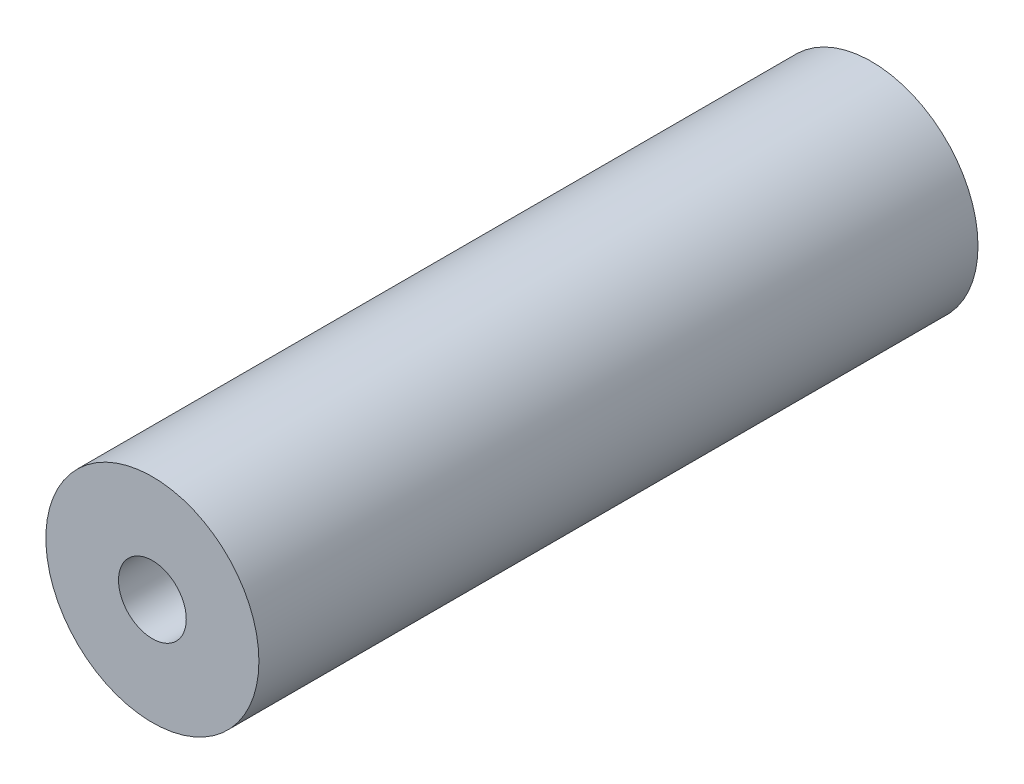
ISO-10303-21;
HEADER;
FILE_DESCRIPTION(('STEP AP214'),'2;1');
FILE_NAME('part.step','',(''),(''),'','','');
FILE_SCHEMA(('AUTOMOTIVE_DESIGN { 1 0 10303 214 1 1 1 1 }'));
ENDSEC;
DATA;
#1=APPLICATION_CONTEXT('core data for automotive mechanical design processes');
#2=APPLICATION_PROTOCOL_DEFINITION('international standard','automotive_design',2000,#1);
#3=PRODUCT_CONTEXT('',#1,'mechanical');
#4=PRODUCT('Part','Part','',(#3));
#5=PRODUCT_RELATED_PRODUCT_CATEGORY('part','',(#4));
#6=PRODUCT_DEFINITION_FORMATION('','',#4);
#7=PRODUCT_DEFINITION_CONTEXT('part definition',#1,'design');
#8=PRODUCT_DEFINITION('design','',#6,#7);
#9=PRODUCT_DEFINITION_SHAPE('','',#8);
#10=(LENGTH_UNIT() NAMED_UNIT(*) SI_UNIT(.MILLI.,.METRE.));
#11=(NAMED_UNIT(*) PLANE_ANGLE_UNIT() SI_UNIT($,.RADIAN.));
#12=(NAMED_UNIT(*) SI_UNIT($,.STERADIAN.) SOLID_ANGLE_UNIT());
#13=UNCERTAINTY_MEASURE_WITH_UNIT(LENGTH_MEASURE(1.E-05),#10,'distance_accuracy_value','');
#14=(GEOMETRIC_REPRESENTATION_CONTEXT(3) GLOBAL_UNCERTAINTY_ASSIGNED_CONTEXT((#13)) GLOBAL_UNIT_ASSIGNED_CONTEXT((#10,
#11,#12)) REPRESENTATION_CONTEXT('',''));
#15=CARTESIAN_POINT('',(0.,0.,0.));
#16=DIRECTION('',(0.,0.,1.));
#17=DIRECTION('',(1.,0.,0.));
#18=AXIS2_PLACEMENT_3D('',#15,#16,#17);
#19=CARTESIAN_POINT('',(0.,0.,21.43125));
#20=DIRECTION('',(0.,0.,-1.));
#21=DIRECTION('',(-1.,0.,0.));
#22=AXIS2_PLACEMENT_3D('',#19,#20,#21);
#23=CYLINDRICAL_SURFACE('',#22,6.35);
#24=CARTESIAN_POINT('',(0.,0.,21.43125));
#25=DIRECTION('',(0.,0.,1.));
#26=DIRECTION('',(1.,0.,0.));
#27=AXIS2_PLACEMENT_3D('',#24,#25,#26);
#28=CIRCLE('',#27,6.35);
#29=CARTESIAN_POINT('',(6.35,0.,21.43125));
#30=VERTEX_POINT('',#29);
#31=EDGE_CURVE('E11',#30,#30,#28,.T.);
#32=ORIENTED_EDGE('',*,*,#31,.F.);
#33=EDGE_LOOP('',(#32));
#34=FACE_BOUND('',#33,.T.);
#35=CARTESIAN_POINT('',(0.,0.,-21.43125));
#36=DIRECTION('',(0.,0.,1.));
#37=DIRECTION('',(1.,0.,0.));
#38=AXIS2_PLACEMENT_3D('',#35,#36,#37);
#39=CIRCLE('',#38,6.35);
#40=CARTESIAN_POINT('',(6.35,0.,-21.43125));
#41=VERTEX_POINT('',#40);
#42=EDGE_CURVE('E56',#41,#41,#39,.T.);
#43=ORIENTED_EDGE('',*,*,#42,.T.);
#44=EDGE_LOOP('',(#43));
#45=FACE_BOUND('',#44,.T.);
#46=ADVANCED_FACE('F53',(#34,#45),#23,.T.);
#47=CARTESIAN_POINT('',(0.,0.,21.43125));
#48=DIRECTION('',(0.,0.,1.));
#49=DIRECTION('',(1.,0.,0.));
#50=AXIS2_PLACEMENT_3D('',#47,#48,#49);
#51=PLANE('',#50);
#52=CARTESIAN_POINT('',(0.,0.,21.43125));
#53=DIRECTION('',(0.,0.,1.));
#54=DIRECTION('',(1.,0.,0.));
#55=AXIS2_PLACEMENT_3D('',#52,#53,#54);
#56=CIRCLE('',#55,2.01929999999999);
#57=CARTESIAN_POINT('',(2.01929999999999,0.,21.43125));
#58=VERTEX_POINT('',#57);
#59=EDGE_CURVE('E77',#58,#58,#56,.T.);
#60=ORIENTED_EDGE('',*,*,#59,.F.);
#61=EDGE_LOOP('',(#60));
#62=FACE_BOUND('',#61,.T.);
#63=ORIENTED_EDGE('',*,*,#31,.T.);
#64=EDGE_LOOP('',(#63));
#65=FACE_BOUND('',#64,.T.);
#66=ADVANCED_FACE('F95',(#62,#65),#51,.T.);
#67=CARTESIAN_POINT('',(0.,0.,-21.43125));
#68=DIRECTION('',(0.,0.,1.));
#69=DIRECTION('',(1.,0.,0.));
#70=AXIS2_PLACEMENT_3D('',#67,#68,#69);
#71=PLANE('',#70);
#72=CARTESIAN_POINT('',(0.,0.,-21.43125));
#73=DIRECTION('',(0.,0.,-1.));
#74=DIRECTION('',(-1.,0.,0.));
#75=AXIS2_PLACEMENT_3D('',#72,#73,#74);
#76=CIRCLE('',#75,2.01929999999999);
#77=CARTESIAN_POINT('',(-2.01929999999999,0.,-21.43125));
#78=VERTEX_POINT('',#77);
#79=EDGE_CURVE('E76',#78,#78,#76,.T.);
#80=ORIENTED_EDGE('',*,*,#79,.F.);
#81=EDGE_LOOP('',(#80));
#82=FACE_BOUND('',#81,.T.);
#83=ORIENTED_EDGE('',*,*,#42,.F.);
#84=EDGE_LOOP('',(#83));
#85=FACE_BOUND('',#84,.T.);
#86=ADVANCED_FACE('F92',(#82,#85),#71,.F.);
#87=CARTESIAN_POINT('',(0.,0.,-9.40181));
#88=DIRECTION('',(0.,0.,-1.));
#89=DIRECTION('',(-1.,0.,0.));
#90=AXIS2_PLACEMENT_3D('',#87,#88,#89);
#91=CONICAL_SURFACE('',#90,2.01929999999999,1.02974425867665);
#92=CARTESIAN_POINT('',(0.,0.,-8.18849215199765));
#93=VERTEX_POINT('',#92);
#94=VERTEX_LOOP('',#93);
#95=FACE_BOUND('',#94,.T.);
#96=CARTESIAN_POINT('',(0.,0.,-9.40181));
#97=DIRECTION('',(0.,0.,-1.));
#98=DIRECTION('',(-1.,0.,0.));
#99=AXIS2_PLACEMENT_3D('',#96,#97,#98);
#100=CIRCLE('',#99,2.01929999999999);
#101=CARTESIAN_POINT('',(-2.01929999999999,0.,-9.40181));
#102=VERTEX_POINT('',#101);
#103=EDGE_CURVE('E80',#102,#102,#100,.T.);
#104=ORIENTED_EDGE('',*,*,#103,.T.);
#105=EDGE_LOOP('',(#104));
#106=FACE_BOUND('',#105,.T.);
#107=ADVANCED_FACE('F94',(#95,#106),#91,.F.);
#108=CARTESIAN_POINT('',(0.,0.,-21.43125));
#109=DIRECTION('',(0.,0.,-1.));
#110=DIRECTION('',(-1.,0.,0.));
#111=AXIS2_PLACEMENT_3D('',#108,#109,#110);
#112=CYLINDRICAL_SURFACE('',#111,2.01929999999999);
#113=ORIENTED_EDGE('',*,*,#103,.F.);
#114=EDGE_LOOP('',(#113));
#115=FACE_BOUND('',#114,.T.);
#116=ORIENTED_EDGE('',*,*,#79,.T.);
#117=EDGE_LOOP('',(#116));
#118=FACE_BOUND('',#117,.T.);
#119=ADVANCED_FACE('F70',(#115,#118),#112,.F.);
#120=CARTESIAN_POINT('',(0.,0.,9.40181));
#121=DIRECTION('',(0.,0.,1.));
#122=DIRECTION('',(1.,0.,0.));
#123=AXIS2_PLACEMENT_3D('',#120,#121,#122);
#124=CONICAL_SURFACE('',#123,2.01929999999999,1.02974425867665);
#125=CARTESIAN_POINT('',(0.,0.,8.18849215199765));
#126=VERTEX_POINT('',#125);
#127=VERTEX_LOOP('',#126);
#128=FACE_BOUND('',#127,.T.);
#129=CARTESIAN_POINT('',(0.,0.,9.40181));
#130=DIRECTION('',(0.,0.,1.));
#131=DIRECTION('',(1.,0.,0.));
#132=AXIS2_PLACEMENT_3D('',#129,#130,#131);
#133=CIRCLE('',#132,2.01929999999999);
#134=CARTESIAN_POINT('',(2.01929999999999,0.,9.40181));
#135=VERTEX_POINT('',#134);
#136=EDGE_CURVE('E74',#135,#135,#133,.T.);
#137=ORIENTED_EDGE('',*,*,#136,.T.);
#138=EDGE_LOOP('',(#137));
#139=FACE_BOUND('',#138,.T.);
#140=ADVANCED_FACE('F66',(#128,#139),#124,.F.);
#141=CARTESIAN_POINT('',(0.,0.,21.43125));
#142=DIRECTION('',(0.,0.,1.));
#143=DIRECTION('',(1.,0.,0.));
#144=AXIS2_PLACEMENT_3D('',#141,#142,#143);
#145=CYLINDRICAL_SURFACE('',#144,2.01929999999999);
#146=ORIENTED_EDGE('',*,*,#136,.F.);
#147=EDGE_LOOP('',(#146));
#148=FACE_BOUND('',#147,.T.);
#149=ORIENTED_EDGE('',*,*,#59,.T.);
#150=EDGE_LOOP('',(#149));
#151=FACE_BOUND('',#150,.T.);
#152=ADVANCED_FACE('F69',(#148,#151),#145,.F.);
#153=CLOSED_SHELL('',(#46,#66,#86,#107,#119,#140,#152));
#154=MANIFOLD_SOLID_BREP('B2',#153);
#155=ADVANCED_BREP_SHAPE_REPRESENTATION('',(#18,#154),#14);
#156=SHAPE_DEFINITION_REPRESENTATION(#9,#155);
ENDSEC;
END-ISO-10303-21;
